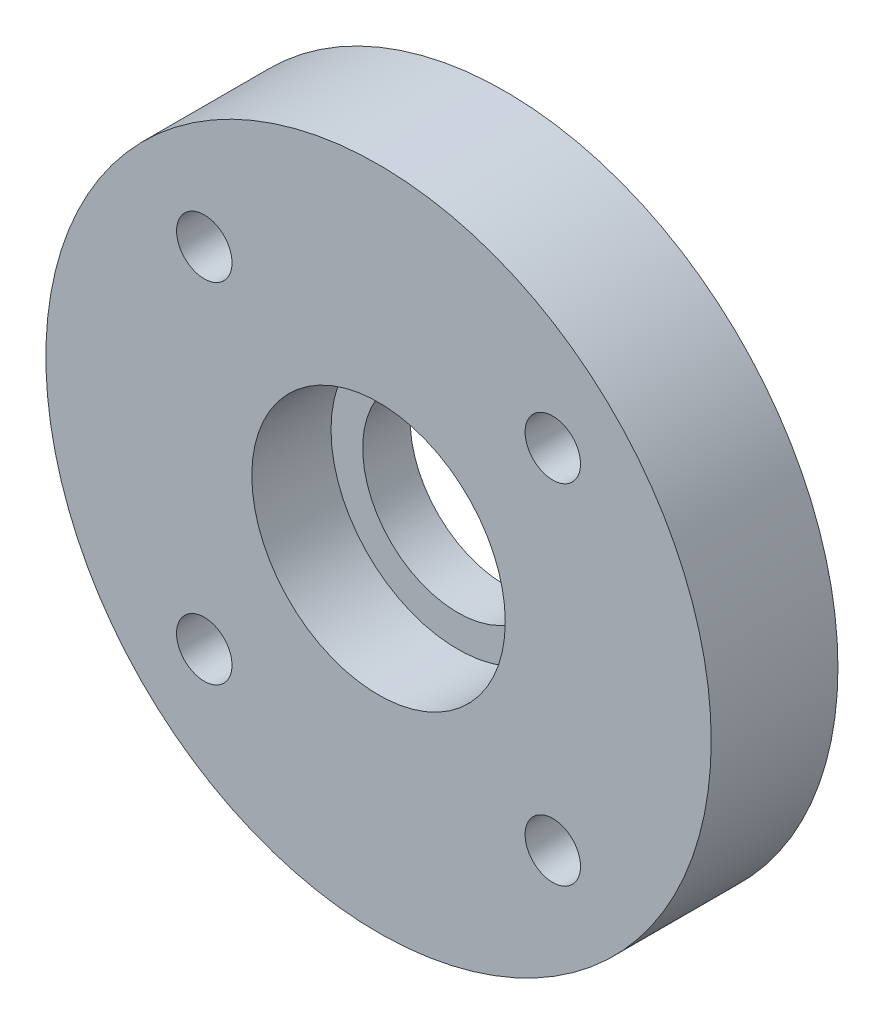
ISO-10303-21;
HEADER;
FILE_DESCRIPTION(('STEP AP214'),'2;1');
FILE_NAME('part.step','',(''),(''),'','','');
FILE_SCHEMA(('AUTOMOTIVE_DESIGN { 1 0 10303 214 1 1 1 1 }'));
ENDSEC;
DATA;
#1=APPLICATION_CONTEXT('core data for automotive mechanical design processes');
#2=APPLICATION_PROTOCOL_DEFINITION('international standard','automotive_design',2000,#1);
#3=PRODUCT_CONTEXT('',#1,'mechanical');
#4=PRODUCT('Part','Part','',(#3));
#5=PRODUCT_RELATED_PRODUCT_CATEGORY('part','',(#4));
#6=PRODUCT_DEFINITION_FORMATION('','',#4);
#7=PRODUCT_DEFINITION_CONTEXT('part definition',#1,'design');
#8=PRODUCT_DEFINITION('design','',#6,#7);
#9=PRODUCT_DEFINITION_SHAPE('','',#8);
#10=(LENGTH_UNIT() NAMED_UNIT(*) SI_UNIT(.MILLI.,.METRE.));
#11=(NAMED_UNIT(*) PLANE_ANGLE_UNIT() SI_UNIT($,.RADIAN.));
#12=(NAMED_UNIT(*) SI_UNIT($,.STERADIAN.) SOLID_ANGLE_UNIT());
#13=UNCERTAINTY_MEASURE_WITH_UNIT(LENGTH_MEASURE(1.E-05),#10,'distance_accuracy_value','');
#14=(GEOMETRIC_REPRESENTATION_CONTEXT(3) GLOBAL_UNCERTAINTY_ASSIGNED_CONTEXT((#13)) GLOBAL_UNIT_ASSIGNED_CONTEXT((#10,
#11,#12)) REPRESENTATION_CONTEXT('',''));
#15=CARTESIAN_POINT('',(0.,0.,0.));
#16=DIRECTION('',(0.,0.,1.));
#17=DIRECTION('',(1.,0.,0.));
#18=AXIS2_PLACEMENT_3D('',#15,#16,#17);
#19=CARTESIAN_POINT('',(0.,0.,0.));
#20=DIRECTION('',(0.,0.,1.));
#21=DIRECTION('',(1.,0.,0.));
#22=AXIS2_PLACEMENT_3D('',#19,#20,#21);
#23=CYLINDRICAL_SURFACE('',#22,6.);
#24=CARTESIAN_POINT('',(0.,0.,0.));
#25=DIRECTION('',(0.,0.,1.));
#26=DIRECTION('',(1.,0.,0.));
#27=AXIS2_PLACEMENT_3D('',#24,#25,#26);
#28=CIRCLE('',#27,6.);
#29=CARTESIAN_POINT('',(6.,0.,0.));
#30=VERTEX_POINT('',#29);
#31=EDGE_CURVE('E44',#30,#30,#28,.T.);
#32=ORIENTED_EDGE('',*,*,#31,.F.);
#33=EDGE_LOOP('',(#32));
#34=FACE_BOUND('',#33,.T.);
#35=CARTESIAN_POINT('',(0.,0.,3.));
#36=DIRECTION('',(0.,0.,1.));
#37=DIRECTION('',(1.,0.,0.));
#38=AXIS2_PLACEMENT_3D('',#35,#36,#37);
#39=CIRCLE('',#38,6.);
#40=CARTESIAN_POINT('',(6.,0.,3.));
#41=VERTEX_POINT('',#40);
#42=EDGE_CURVE('E35',#41,#41,#39,.F.);
#43=ORIENTED_EDGE('',*,*,#42,.F.);
#44=EDGE_LOOP('',(#43));
#45=FACE_BOUND('',#44,.T.);
#46=ADVANCED_FACE('F31',(#34,#45),#23,.F.);
#47=CARTESIAN_POINT('',(0.,0.,8.));
#48=DIRECTION('',(0.,0.,-1.));
#49=DIRECTION('',(-1.,0.,0.));
#50=AXIS2_PLACEMENT_3D('',#47,#48,#49);
#51=CYLINDRICAL_SURFACE('',#50,21.);
#52=CARTESIAN_POINT('',(0.,0.,8.));
#53=DIRECTION('',(0.,0.,1.));
#54=DIRECTION('',(1.,0.,0.));
#55=AXIS2_PLACEMENT_3D('',#52,#53,#54);
#56=CIRCLE('',#55,21.);
#57=CARTESIAN_POINT('',(21.,0.,8.));
#58=VERTEX_POINT('',#57);
#59=EDGE_CURVE('E10',#58,#58,#56,.T.);
#60=ORIENTED_EDGE('',*,*,#59,.F.);
#61=EDGE_LOOP('',(#60));
#62=FACE_BOUND('',#61,.T.);
#63=CARTESIAN_POINT('',(0.,0.,0.));
#64=DIRECTION('',(0.,0.,1.));
#65=DIRECTION('',(1.,0.,0.));
#66=AXIS2_PLACEMENT_3D('',#63,#64,#65);
#67=CIRCLE('',#66,21.);
#68=CARTESIAN_POINT('',(21.,0.,0.));
#69=VERTEX_POINT('',#68);
#70=EDGE_CURVE('E39',#69,#69,#67,.T.);
#71=ORIENTED_EDGE('',*,*,#70,.T.);
#72=EDGE_LOOP('',(#71));
#73=FACE_BOUND('',#72,.T.);
#74=ADVANCED_FACE('F33',(#62,#73),#51,.T.);
#75=CARTESIAN_POINT('',(0.,0.,8.));
#76=DIRECTION('',(0.,0.,1.));
#77=DIRECTION('',(1.,0.,0.));
#78=AXIS2_PLACEMENT_3D('',#75,#76,#77);
#79=PLANE('',#78);
#80=CARTESIAN_POINT('',(-11.,-11.,8.));
#81=DIRECTION('',(0.,0.,1.));
#82=DIRECTION('',(-1.,0.,0.));
#83=AXIS2_PLACEMENT_3D('',#80,#81,#82);
#84=CIRCLE('',#83,1.75);
#85=CARTESIAN_POINT('',(-12.75,-11.,8.));
#86=VERTEX_POINT('',#85);
#87=EDGE_CURVE('E73',#86,#86,#84,.T.);
#88=ORIENTED_EDGE('',*,*,#87,.F.);
#89=EDGE_LOOP('',(#88));
#90=FACE_BOUND('',#89,.T.);
#91=CARTESIAN_POINT('',(11.,-11.,8.));
#92=DIRECTION('',(0.,0.,1.));
#93=DIRECTION('',(1.,0.,0.));
#94=AXIS2_PLACEMENT_3D('',#91,#92,#93);
#95=CIRCLE('',#94,1.75);
#96=CARTESIAN_POINT('',(12.75,-11.,8.));
#97=VERTEX_POINT('',#96);
#98=EDGE_CURVE('E67',#97,#97,#95,.T.);
#99=ORIENTED_EDGE('',*,*,#98,.F.);
#100=EDGE_LOOP('',(#99));
#101=FACE_BOUND('',#100,.T.);
#102=CARTESIAN_POINT('',(11.,11.,8.));
#103=DIRECTION('',(0.,0.,1.));
#104=DIRECTION('',(-1.,0.,0.));
#105=AXIS2_PLACEMENT_3D('',#102,#103,#104);
#106=CIRCLE('',#105,1.75);
#107=CARTESIAN_POINT('',(9.25,11.,8.));
#108=VERTEX_POINT('',#107);
#109=EDGE_CURVE('E61',#108,#108,#106,.T.);
#110=ORIENTED_EDGE('',*,*,#109,.F.);
#111=EDGE_LOOP('',(#110));
#112=FACE_BOUND('',#111,.T.);
#113=CARTESIAN_POINT('',(-11.,11.,8.));
#114=DIRECTION('',(0.,0.,1.));
#115=DIRECTION('',(1.,0.,0.));
#116=AXIS2_PLACEMENT_3D('',#113,#114,#115);
#117=CIRCLE('',#116,1.75);
#118=CARTESIAN_POINT('',(-9.25,11.,8.));
#119=VERTEX_POINT('',#118);
#120=EDGE_CURVE('E55',#119,#119,#117,.T.);
#121=ORIENTED_EDGE('',*,*,#120,.F.);
#122=EDGE_LOOP('',(#121));
#123=FACE_BOUND('',#122,.T.);
#124=CARTESIAN_POINT('',(0.,0.,8.));
#125=DIRECTION('',(0.,0.,1.));
#126=DIRECTION('',(1.,0.,0.));
#127=AXIS2_PLACEMENT_3D('',#124,#125,#126);
#128=CIRCLE('',#127,8.);
#129=CARTESIAN_POINT('',(8.,0.,8.));
#130=VERTEX_POINT('',#129);
#131=EDGE_CURVE('E48',#130,#130,#128,.T.);
#132=ORIENTED_EDGE('',*,*,#131,.F.);
#133=EDGE_LOOP('',(#132));
#134=FACE_BOUND('',#133,.T.);
#135=ORIENTED_EDGE('',*,*,#59,.T.);
#136=EDGE_LOOP('',(#135));
#137=FACE_BOUND('',#136,.T.);
#138=ADVANCED_FACE('F89',(#90,#101,#112,#123,#134,#137),#79,.T.);
#139=CARTESIAN_POINT('',(0.,0.,0.));
#140=DIRECTION('',(0.,0.,1.));
#141=DIRECTION('',(1.,0.,0.));
#142=AXIS2_PLACEMENT_3D('',#139,#140,#141);
#143=PLANE('',#142);
#144=CARTESIAN_POINT('',(-11.,-11.,0.));
#145=DIRECTION('',(0.,0.,1.));
#146=DIRECTION('',(-1.,0.,0.));
#147=AXIS2_PLACEMENT_3D('',#144,#145,#146);
#148=CIRCLE('',#147,1.75);
#149=CARTESIAN_POINT('',(-12.75,-11.,0.));
#150=VERTEX_POINT('',#149);
#151=EDGE_CURVE('E70',#150,#150,#148,.T.);
#152=ORIENTED_EDGE('',*,*,#151,.T.);
#153=EDGE_LOOP('',(#152));
#154=FACE_BOUND('',#153,.T.);
#155=CARTESIAN_POINT('',(11.,-11.,0.));
#156=DIRECTION('',(0.,0.,1.));
#157=DIRECTION('',(1.,0.,0.));
#158=AXIS2_PLACEMENT_3D('',#155,#156,#157);
#159=CIRCLE('',#158,1.75);
#160=CARTESIAN_POINT('',(12.75,-11.,0.));
#161=VERTEX_POINT('',#160);
#162=EDGE_CURVE('E64',#161,#161,#159,.T.);
#163=ORIENTED_EDGE('',*,*,#162,.T.);
#164=EDGE_LOOP('',(#163));
#165=FACE_BOUND('',#164,.T.);
#166=CARTESIAN_POINT('',(11.,11.,0.));
#167=DIRECTION('',(0.,0.,1.));
#168=DIRECTION('',(-1.,0.,0.));
#169=AXIS2_PLACEMENT_3D('',#166,#167,#168);
#170=CIRCLE('',#169,1.75);
#171=CARTESIAN_POINT('',(9.25,11.,0.));
#172=VERTEX_POINT('',#171);
#173=EDGE_CURVE('E58',#172,#172,#170,.T.);
#174=ORIENTED_EDGE('',*,*,#173,.T.);
#175=EDGE_LOOP('',(#174));
#176=FACE_BOUND('',#175,.T.);
#177=CARTESIAN_POINT('',(-11.,11.,0.));
#178=DIRECTION('',(0.,0.,1.));
#179=DIRECTION('',(1.,0.,0.));
#180=AXIS2_PLACEMENT_3D('',#177,#178,#179);
#181=CIRCLE('',#180,1.75);
#182=CARTESIAN_POINT('',(-9.25,11.,0.));
#183=VERTEX_POINT('',#182);
#184=EDGE_CURVE('E52',#183,#183,#181,.T.);
#185=ORIENTED_EDGE('',*,*,#184,.T.);
#186=EDGE_LOOP('',(#185));
#187=FACE_BOUND('',#186,.T.);
#188=ORIENTED_EDGE('',*,*,#31,.T.);
#189=EDGE_LOOP('',(#188));
#190=FACE_BOUND('',#189,.T.);
#191=ORIENTED_EDGE('',*,*,#70,.F.);
#192=EDGE_LOOP('',(#191));
#193=FACE_BOUND('',#192,.T.);
#194=ADVANCED_FACE('F79',(#154,#165,#176,#187,#190,#193),#143,.F.);
#195=CARTESIAN_POINT('',(0.,0.,3.));
#196=DIRECTION('',(0.,0.,1.));
#197=DIRECTION('',(1.,0.,0.));
#198=AXIS2_PLACEMENT_3D('',#195,#196,#197);
#199=PLANE('',#198);
#200=CARTESIAN_POINT('',(0.,0.,3.));
#201=DIRECTION('',(0.,0.,1.));
#202=DIRECTION('',(1.,0.,0.));
#203=AXIS2_PLACEMENT_3D('',#200,#201,#202);
#204=CIRCLE('',#203,8.);
#205=CARTESIAN_POINT('',(8.,0.,3.));
#206=VERTEX_POINT('',#205);
#207=EDGE_CURVE('E51',#206,#206,#204,.T.);
#208=ORIENTED_EDGE('',*,*,#207,.T.);
#209=EDGE_LOOP('',(#208));
#210=FACE_BOUND('',#209,.T.);
#211=ORIENTED_EDGE('',*,*,#42,.T.);
#212=EDGE_LOOP('',(#211));
#213=FACE_BOUND('',#212,.T.);
#214=ADVANCED_FACE('F104',(#210,#213),#199,.T.);
#215=CARTESIAN_POINT('',(0.,0.,3.));
#216=DIRECTION('',(0.,0.,1.));
#217=DIRECTION('',(1.,0.,0.));
#218=AXIS2_PLACEMENT_3D('',#215,#216,#217);
#219=CYLINDRICAL_SURFACE('',#218,8.);
#220=ORIENTED_EDGE('',*,*,#207,.F.);
#221=EDGE_LOOP('',(#220));
#222=FACE_BOUND('',#221,.T.);
#223=ORIENTED_EDGE('',*,*,#131,.T.);
#224=EDGE_LOOP('',(#223));
#225=FACE_BOUND('',#224,.T.);
#226=ADVANCED_FACE('F101',(#222,#225),#219,.F.);
#227=CARTESIAN_POINT('',(-11.,11.,0.));
#228=DIRECTION('',(0.,0.,1.));
#229=DIRECTION('',(1.,0.,0.));
#230=AXIS2_PLACEMENT_3D('',#227,#228,#229);
#231=CYLINDRICAL_SURFACE('',#230,1.75);
#232=ORIENTED_EDGE('',*,*,#184,.F.);
#233=EDGE_LOOP('',(#232));
#234=FACE_BOUND('',#233,.T.);
#235=ORIENTED_EDGE('',*,*,#120,.T.);
#236=EDGE_LOOP('',(#235));
#237=FACE_BOUND('',#236,.T.);
#238=ADVANCED_FACE('F103',(#234,#237),#231,.F.);
#239=CARTESIAN_POINT('',(11.,11.,0.));
#240=DIRECTION('',(0.,0.,1.));
#241=DIRECTION('',(1.,0.,0.));
#242=AXIS2_PLACEMENT_3D('',#239,#240,#241);
#243=CYLINDRICAL_SURFACE('',#242,1.75);
#244=ORIENTED_EDGE('',*,*,#173,.F.);
#245=EDGE_LOOP('',(#244));
#246=FACE_BOUND('',#245,.T.);
#247=ORIENTED_EDGE('',*,*,#109,.T.);
#248=EDGE_LOOP('',(#247));
#249=FACE_BOUND('',#248,.T.);
#250=ADVANCED_FACE('F111',(#246,#249),#243,.F.);
#251=CARTESIAN_POINT('',(11.,-11.,0.));
#252=DIRECTION('',(0.,0.,1.));
#253=DIRECTION('',(1.,0.,0.));
#254=AXIS2_PLACEMENT_3D('',#251,#252,#253);
#255=CYLINDRICAL_SURFACE('',#254,1.75);
#256=ORIENTED_EDGE('',*,*,#162,.F.);
#257=EDGE_LOOP('',(#256));
#258=FACE_BOUND('',#257,.T.);
#259=ORIENTED_EDGE('',*,*,#98,.T.);
#260=EDGE_LOOP('',(#259));
#261=FACE_BOUND('',#260,.T.);
#262=ADVANCED_FACE('F85',(#258,#261),#255,.F.);
#263=CARTESIAN_POINT('',(-11.,-11.,0.));
#264=DIRECTION('',(0.,0.,1.));
#265=DIRECTION('',(1.,0.,0.));
#266=AXIS2_PLACEMENT_3D('',#263,#264,#265);
#267=CYLINDRICAL_SURFACE('',#266,1.75);
#268=ORIENTED_EDGE('',*,*,#151,.F.);
#269=EDGE_LOOP('',(#268));
#270=FACE_BOUND('',#269,.T.);
#271=ORIENTED_EDGE('',*,*,#87,.T.);
#272=EDGE_LOOP('',(#271));
#273=FACE_BOUND('',#272,.T.);
#274=ADVANCED_FACE('F82',(#270,#273),#267,.F.);
#275=CLOSED_SHELL('',(#46,#74,#138,#194,#214,#226,#238,#250,#262,#274));
#276=MANIFOLD_SOLID_BREP('B2',#275);
#277=ADVANCED_BREP_SHAPE_REPRESENTATION('',(#18,#276),#14);
#278=SHAPE_DEFINITION_REPRESENTATION(#9,#277);
ENDSEC;
END-ISO-10303-21;
